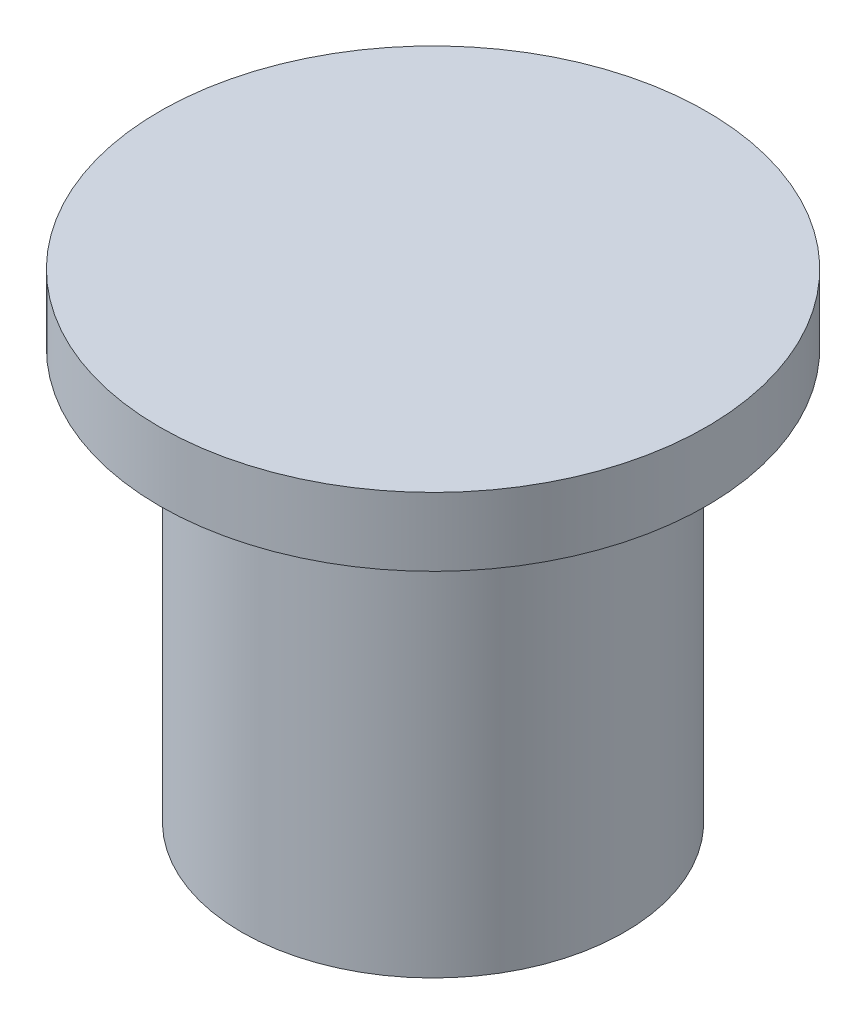
ISO-10303-21;
HEADER;
FILE_DESCRIPTION(('STEP AP214'),'2;1');
FILE_NAME('part.step','',(''),(''),'','','');
FILE_SCHEMA(('AUTOMOTIVE_DESIGN { 1 0 10303 214 1 1 1 1 }'));
ENDSEC;
DATA;
#1=APPLICATION_CONTEXT('core data for automotive mechanical design processes');
#2=APPLICATION_PROTOCOL_DEFINITION('international standard','automotive_design',2000,#1);
#3=PRODUCT_CONTEXT('',#1,'mechanical');
#4=PRODUCT('Part','Part','',(#3));
#5=PRODUCT_RELATED_PRODUCT_CATEGORY('part','',(#4));
#6=PRODUCT_DEFINITION_FORMATION('','',#4);
#7=PRODUCT_DEFINITION_CONTEXT('part definition',#1,'design');
#8=PRODUCT_DEFINITION('design','',#6,#7);
#9=PRODUCT_DEFINITION_SHAPE('','',#8);
#10=(LENGTH_UNIT() NAMED_UNIT(*) SI_UNIT(.MILLI.,.METRE.));
#11=(NAMED_UNIT(*) PLANE_ANGLE_UNIT() SI_UNIT($,.RADIAN.));
#12=(NAMED_UNIT(*) SI_UNIT($,.STERADIAN.) SOLID_ANGLE_UNIT());
#13=UNCERTAINTY_MEASURE_WITH_UNIT(LENGTH_MEASURE(1.E-05),#10,'distance_accuracy_value','');
#14=(GEOMETRIC_REPRESENTATION_CONTEXT(3) GLOBAL_UNCERTAINTY_ASSIGNED_CONTEXT((#13)) GLOBAL_UNIT_ASSIGNED_CONTEXT((#10,
#11,#12)) REPRESENTATION_CONTEXT('',''));
#15=CARTESIAN_POINT('',(0.,0.,0.));
#16=DIRECTION('',(0.,0.,1.));
#17=DIRECTION('',(1.,0.,0.));
#18=AXIS2_PLACEMENT_3D('',#15,#16,#17);
#19=CARTESIAN_POINT('',(0.,3.,0.));
#20=DIRECTION('',(0.,-1.,0.));
#21=DIRECTION('',(0.,0.,-1.));
#22=AXIS2_PLACEMENT_3D('',#19,#20,#21);
#23=CYLINDRICAL_SURFACE('',#22,1.4);
#24=CARTESIAN_POINT('',(0.,3.,0.));
#25=DIRECTION('',(0.,1.,0.));
#26=DIRECTION('',(0.,0.,1.));
#27=AXIS2_PLACEMENT_3D('',#24,#25,#26);
#28=CIRCLE('',#27,1.4);
#29=CARTESIAN_POINT('',(0.,3.,1.4));
#30=VERTEX_POINT('',#29);
#31=EDGE_CURVE('E10',#30,#30,#28,.T.);
#32=ORIENTED_EDGE('',*,*,#31,.F.);
#33=EDGE_LOOP('',(#32));
#34=FACE_BOUND('',#33,.T.);
#35=CARTESIAN_POINT('',(0.,0.,0.));
#36=DIRECTION('',(0.,1.,0.));
#37=DIRECTION('',(0.,0.,1.));
#38=AXIS2_PLACEMENT_3D('',#35,#36,#37);
#39=CIRCLE('',#38,1.4);
#40=CARTESIAN_POINT('',(0.,0.,1.4));
#41=VERTEX_POINT('',#40);
#42=EDGE_CURVE('E40',#41,#41,#39,.T.);
#43=ORIENTED_EDGE('',*,*,#42,.T.);
#44=EDGE_LOOP('',(#43));
#45=FACE_BOUND('',#44,.T.);
#46=ADVANCED_FACE('F37',(#34,#45),#23,.T.);
#47=CARTESIAN_POINT('',(0.,0.,0.));
#48=DIRECTION('',(0.,1.,0.));
#49=DIRECTION('',(0.,0.,1.));
#50=AXIS2_PLACEMENT_3D('',#47,#48,#49);
#51=PLANE('',#50);
#52=ORIENTED_EDGE('',*,*,#42,.F.);
#53=EDGE_LOOP('',(#52));
#54=FACE_BOUND('',#53,.T.);
#55=ADVANCED_FACE('F60',(#54),#51,.F.);
#56=CARTESIAN_POINT('',(0.,3.5,0.));
#57=DIRECTION('',(0.,-1.,0.));
#58=DIRECTION('',(0.,0.,-1.));
#59=AXIS2_PLACEMENT_3D('',#56,#57,#58);
#60=CYLINDRICAL_SURFACE('',#59,2.);
#61=CARTESIAN_POINT('',(0.,3.5,0.));
#62=DIRECTION('',(0.,1.,0.));
#63=DIRECTION('',(0.,0.,1.));
#64=AXIS2_PLACEMENT_3D('',#61,#62,#63);
#65=CIRCLE('',#64,2.);
#66=CARTESIAN_POINT('',(0.,3.5,2.));
#67=VERTEX_POINT('',#66);
#68=EDGE_CURVE('E47',#67,#67,#65,.T.);
#69=ORIENTED_EDGE('',*,*,#68,.F.);
#70=EDGE_LOOP('',(#69));
#71=FACE_BOUND('',#70,.T.);
#72=CARTESIAN_POINT('',(0.,3.,0.));
#73=DIRECTION('',(0.,1.,0.));
#74=DIRECTION('',(0.,0.,1.));
#75=AXIS2_PLACEMENT_3D('',#72,#73,#74);
#76=CIRCLE('',#75,2.);
#77=CARTESIAN_POINT('',(0.,3.,2.));
#78=VERTEX_POINT('',#77);
#79=EDGE_CURVE('E49',#78,#78,#76,.T.);
#80=ORIENTED_EDGE('',*,*,#79,.T.);
#81=EDGE_LOOP('',(#80));
#82=FACE_BOUND('',#81,.T.);
#83=ADVANCED_FACE('F57',(#71,#82),#60,.T.);
#84=CARTESIAN_POINT('',(0.,3.5,0.));
#85=DIRECTION('',(0.,1.,0.));
#86=DIRECTION('',(0.,0.,1.));
#87=AXIS2_PLACEMENT_3D('',#84,#85,#86);
#88=PLANE('',#87);
#89=ORIENTED_EDGE('',*,*,#68,.T.);
#90=EDGE_LOOP('',(#89));
#91=FACE_BOUND('',#90,.T.);
#92=ADVANCED_FACE('F55',(#91),#88,.T.);
#93=CARTESIAN_POINT('',(0.,3.,0.));
#94=DIRECTION('',(0.,1.,0.));
#95=DIRECTION('',(0.,0.,1.));
#96=AXIS2_PLACEMENT_3D('',#93,#94,#95);
#97=PLANE('',#96);
#98=ORIENTED_EDGE('',*,*,#31,.T.);
#99=EDGE_LOOP('',(#98));
#100=FACE_BOUND('',#99,.T.);
#101=ORIENTED_EDGE('',*,*,#79,.F.);
#102=EDGE_LOOP('',(#101));
#103=FACE_BOUND('',#102,.T.);
#104=ADVANCED_FACE('F64',(#100,#103),#97,.F.);
#105=CLOSED_SHELL('',(#46,#55,#83,#92,#104));
#106=MANIFOLD_SOLID_BREP('B2',#105);
#107=ADVANCED_BREP_SHAPE_REPRESENTATION('',(#18,#106),#14);
#108=SHAPE_DEFINITION_REPRESENTATION(#9,#107);
ENDSEC;
END-ISO-10303-21;
